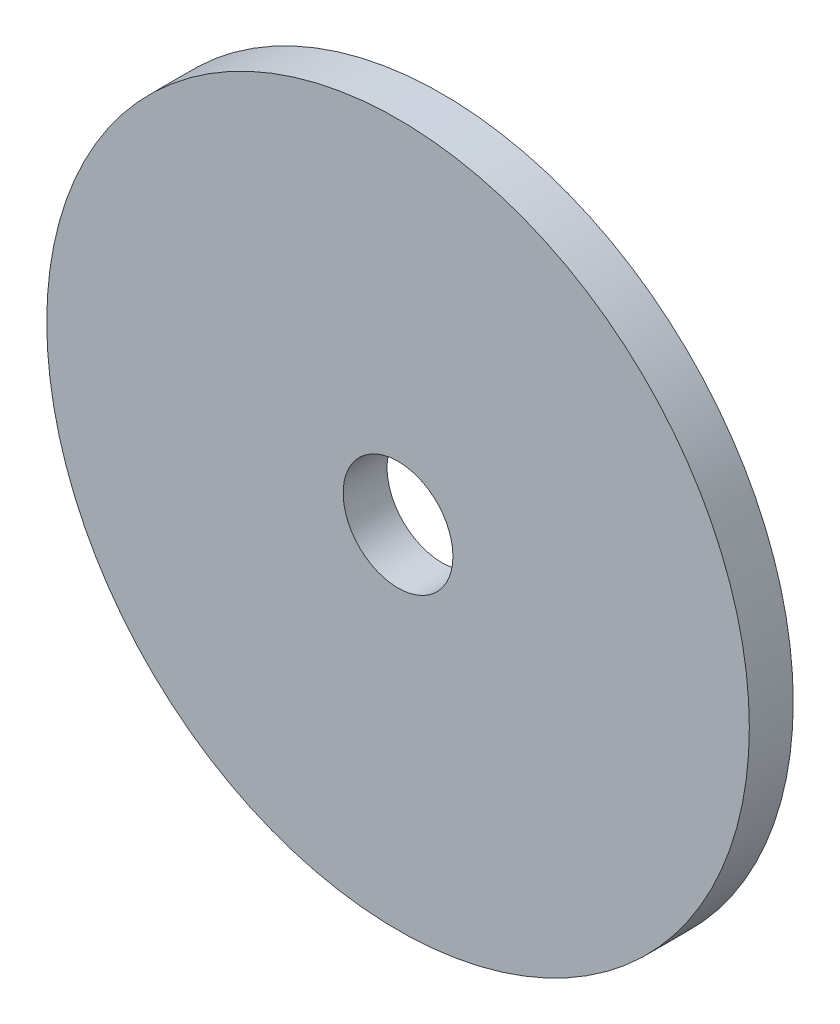
ISO-10303-21;
HEADER;
FILE_DESCRIPTION(('STEP AP214'),'2;1');
FILE_NAME('part.step','',(''),(''),'','','');
FILE_SCHEMA(('AUTOMOTIVE_DESIGN { 1 0 10303 214 1 1 1 1 }'));
ENDSEC;
DATA;
#1=APPLICATION_CONTEXT('core data for automotive mechanical design processes');
#2=APPLICATION_PROTOCOL_DEFINITION('international standard','automotive_design',2000,#1);
#3=PRODUCT_CONTEXT('',#1,'mechanical');
#4=PRODUCT('Part','Part','',(#3));
#5=PRODUCT_RELATED_PRODUCT_CATEGORY('part','',(#4));
#6=PRODUCT_DEFINITION_FORMATION('','',#4);
#7=PRODUCT_DEFINITION_CONTEXT('part definition',#1,'design');
#8=PRODUCT_DEFINITION('design','',#6,#7);
#9=PRODUCT_DEFINITION_SHAPE('','',#8);
#10=(LENGTH_UNIT() NAMED_UNIT(*) SI_UNIT(.MILLI.,.METRE.));
#11=(NAMED_UNIT(*) PLANE_ANGLE_UNIT() SI_UNIT($,.RADIAN.));
#12=(NAMED_UNIT(*) SI_UNIT($,.STERADIAN.) SOLID_ANGLE_UNIT());
#13=UNCERTAINTY_MEASURE_WITH_UNIT(LENGTH_MEASURE(1.E-05),#10,'distance_accuracy_value','');
#14=(GEOMETRIC_REPRESENTATION_CONTEXT(3) GLOBAL_UNCERTAINTY_ASSIGNED_CONTEXT((#13)) GLOBAL_UNIT_ASSIGNED_CONTEXT((#10,
#11,#12)) REPRESENTATION_CONTEXT('',''));
#15=CARTESIAN_POINT('',(0.,0.,0.));
#16=DIRECTION('',(0.,0.,1.));
#17=DIRECTION('',(1.,0.,0.));
#18=AXIS2_PLACEMENT_3D('',#15,#16,#17);
#19=CARTESIAN_POINT('',(0.,0.,15.));
#20=DIRECTION('',(0.,0.,1.));
#21=DIRECTION('',(1.,0.,0.));
#22=AXIS2_PLACEMENT_3D('',#19,#20,#21);
#23=PLANE('',#22);
#24=CARTESIAN_POINT('',(0.,0.,15.));
#25=DIRECTION('',(0.,0.,1.));
#26=DIRECTION('',(1.,0.,0.));
#27=AXIS2_PLACEMENT_3D('',#24,#25,#26);
#28=CIRCLE('',#27,120.);
#29=CARTESIAN_POINT('',(120.,0.,15.));
#30=VERTEX_POINT('',#29);
#31=EDGE_CURVE('E10',#30,#30,#28,.T.);
#32=ORIENTED_EDGE('',*,*,#31,.T.);
#33=EDGE_LOOP('',(#32));
#34=FACE_BOUND('',#33,.T.);
#35=CARTESIAN_POINT('',(0.,0.,15.));
#36=DIRECTION('',(0.,0.,1.));
#37=DIRECTION('',(1.,0.,0.));
#38=AXIS2_PLACEMENT_3D('',#35,#36,#37);
#39=CIRCLE('',#38,18.75);
#40=CARTESIAN_POINT('',(18.75,0.,15.));
#41=VERTEX_POINT('',#40);
#42=EDGE_CURVE('E50',#41,#41,#39,.T.);
#43=ORIENTED_EDGE('',*,*,#42,.F.);
#44=EDGE_LOOP('',(#43));
#45=FACE_BOUND('',#44,.T.);
#46=ADVANCED_FACE('F37',(#34,#45),#23,.T.);
#47=CARTESIAN_POINT('',(0.,0.,0.));
#48=DIRECTION('',(0.,0.,1.));
#49=DIRECTION('',(1.,0.,0.));
#50=AXIS2_PLACEMENT_3D('',#47,#48,#49);
#51=PLANE('',#50);
#52=CARTESIAN_POINT('',(0.,0.,0.));
#53=DIRECTION('',(0.,0.,1.));
#54=DIRECTION('',(1.,0.,0.));
#55=AXIS2_PLACEMENT_3D('',#52,#53,#54);
#56=CIRCLE('',#55,120.);
#57=CARTESIAN_POINT('',(120.,0.,0.));
#58=VERTEX_POINT('',#57);
#59=EDGE_CURVE('E41',#58,#58,#56,.T.);
#60=ORIENTED_EDGE('',*,*,#59,.F.);
#61=EDGE_LOOP('',(#60));
#62=FACE_BOUND('',#61,.T.);
#63=CARTESIAN_POINT('',(0.,0.,0.));
#64=DIRECTION('',(0.,0.,1.));
#65=DIRECTION('',(1.,0.,0.));
#66=AXIS2_PLACEMENT_3D('',#63,#64,#65);
#67=CIRCLE('',#66,18.75);
#68=CARTESIAN_POINT('',(18.75,0.,0.));
#69=VERTEX_POINT('',#68);
#70=EDGE_CURVE('E52',#69,#69,#67,.T.);
#71=ORIENTED_EDGE('',*,*,#70,.T.);
#72=EDGE_LOOP('',(#71));
#73=FACE_BOUND('',#72,.T.);
#74=ADVANCED_FACE('F64',(#62,#73),#51,.F.);
#75=CARTESIAN_POINT('',(0.,0.,15.));
#76=DIRECTION('',(0.,0.,-1.));
#77=DIRECTION('',(-1.,0.,0.));
#78=AXIS2_PLACEMENT_3D('',#75,#76,#77);
#79=CYLINDRICAL_SURFACE('',#78,120.);
#80=ORIENTED_EDGE('',*,*,#31,.F.);
#81=EDGE_LOOP('',(#80));
#82=FACE_BOUND('',#81,.T.);
#83=ORIENTED_EDGE('',*,*,#59,.T.);
#84=EDGE_LOOP('',(#83));
#85=FACE_BOUND('',#84,.T.);
#86=ADVANCED_FACE('F39',(#82,#85),#79,.T.);
#87=CARTESIAN_POINT('',(0.,0.,15.));
#88=DIRECTION('',(0.,0.,-1.));
#89=DIRECTION('',(-1.,0.,0.));
#90=AXIS2_PLACEMENT_3D('',#87,#88,#89);
#91=CYLINDRICAL_SURFACE('',#90,18.75);
#92=ORIENTED_EDGE('',*,*,#42,.T.);
#93=EDGE_LOOP('',(#92));
#94=FACE_BOUND('',#93,.T.);
#95=ORIENTED_EDGE('',*,*,#70,.F.);
#96=EDGE_LOOP('',(#95));
#97=FACE_BOUND('',#96,.T.);
#98=ADVANCED_FACE('F60',(#94,#97),#91,.F.);
#99=CLOSED_SHELL('',(#46,#74,#86,#98));
#100=MANIFOLD_SOLID_BREP('B2',#99);
#101=ADVANCED_BREP_SHAPE_REPRESENTATION('',(#18,#100),#14);
#102=SHAPE_DEFINITION_REPRESENTATION(#9,#101);
ENDSEC;
END-ISO-10303-21;
